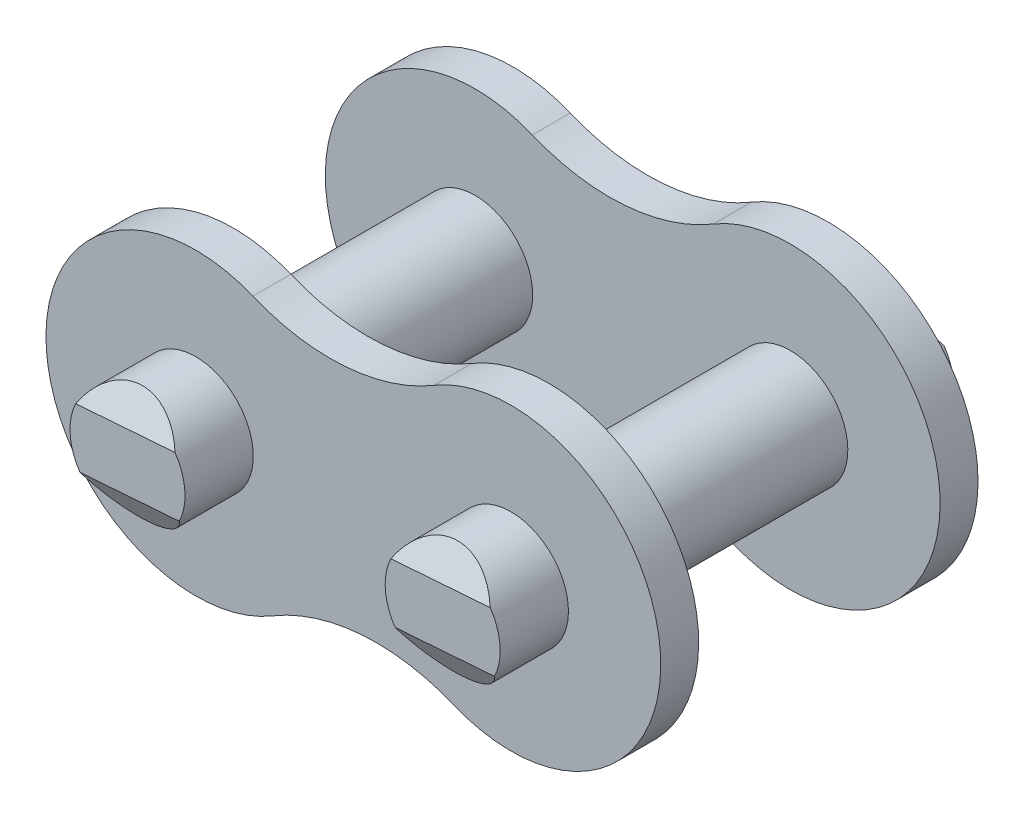
ISO-10303-21;
HEADER;
FILE_DESCRIPTION(('STEP AP214'),'2;1');
FILE_NAME('part.step','',(''),(''),'','','');
FILE_SCHEMA(('AUTOMOTIVE_DESIGN { 1 0 10303 214 1 1 1 1 }'));
ENDSEC;
DATA;
#1=APPLICATION_CONTEXT('core data for automotive mechanical design processes');
#2=APPLICATION_PROTOCOL_DEFINITION('international standard','automotive_design',2000,#1);
#3=PRODUCT_CONTEXT('',#1,'mechanical');
#4=PRODUCT('Part','Part','',(#3));
#5=PRODUCT_RELATED_PRODUCT_CATEGORY('part','',(#4));
#6=PRODUCT_DEFINITION_FORMATION('','',#4);
#7=PRODUCT_DEFINITION_CONTEXT('part definition',#1,'design');
#8=PRODUCT_DEFINITION('design','',#6,#7);
#9=PRODUCT_DEFINITION_SHAPE('','',#8);
#10=(LENGTH_UNIT() NAMED_UNIT(*) SI_UNIT(.MILLI.,.METRE.));
#11=(NAMED_UNIT(*) PLANE_ANGLE_UNIT() SI_UNIT($,.RADIAN.));
#12=(NAMED_UNIT(*) SI_UNIT($,.STERADIAN.) SOLID_ANGLE_UNIT());
#13=UNCERTAINTY_MEASURE_WITH_UNIT(LENGTH_MEASURE(1.E-05),#10,'distance_accuracy_value','');
#14=(GEOMETRIC_REPRESENTATION_CONTEXT(3) GLOBAL_UNCERTAINTY_ASSIGNED_CONTEXT((#13)) GLOBAL_UNIT_ASSIGNED_CONTEXT((#10,
#11,#12)) REPRESENTATION_CONTEXT('',''));
#15=CARTESIAN_POINT('',(0.,0.,0.));
#16=DIRECTION('',(0.,0.,1.));
#17=DIRECTION('',(1.,0.,0.));
#18=AXIS2_PLACEMENT_3D('',#15,#16,#17);
#19=CARTESIAN_POINT('',(127.480334533427,80.0274905231317,-131.392489073474));
#20=DIRECTION('',(-0.0368173091730591,0.49864264332812,0.866025403784439));
#21=DIRECTION('',(0.997285286656241,0.0736346183461183,0.));
#22=AXIS2_PLACEMENT_3D('',#19,#20,#21);
#23=PLANE('',#22);
#24=CARTESIAN_POINT('',(112.953221597664,79.8240147279796,-131.892921853051));
#25=DIRECTION('',(0.0368173091730591,-0.498642643328121,-0.866025403784439));
#26=DIRECTION('',(0.0637694500857102,-0.863674393064751,0.5));
#27=AXIS2_PLACEMENT_3D('',#24,#25,#26);
#28=ELLIPSE('',#27,1.3344874122049,1.1557);
#29=CARTESIAN_POINT('',(113.99391985794,79.3214317785493,-131.5593));
#30=VERTEX_POINT('',#29);
#31=CARTESIAN_POINT('',(111.99762286581,79.1740350716212,-131.5593));
#32=VERTEX_POINT('',#31);
#33=EDGE_CURVE('E277',#30,#32,#28,.T.);
#34=ORIENTED_EDGE('',*,*,#33,.T.);
#35=DIRECTION('',(-0.997285286656241,-0.0736346183461183,0.));
#36=VECTOR('',#35,1.);
#37=CARTESIAN_POINT('',(127.459059651322,80.3156311745789,-131.5593));
#38=LINE('',#37,#36);
#39=EDGE_CURVE('E294',#30,#32,#38,.T.);
#40=ORIENTED_EDGE('',*,*,#39,.F.);
#41=EDGE_LOOP('',(#34,#40));
#42=FACE_BOUND('',#41,.T.);
#43=ADVANCED_FACE('F17',(#42),#23,.F.);
#44=CARTESIAN_POINT('',(127.352685240793,81.7563344318146,-131.392489073474));
#45=DIRECTION('',(-0.0368173091730593,0.498642643328122,-0.866025403784438));
#46=DIRECTION('',(-0.999097546934089,0.,0.0424746007666461));
#47=AXIS2_PLACEMENT_3D('',#44,#45,#46);
#48=PLANE('',#47);
#49=CARTESIAN_POINT('',(112.953221597664,79.8240147279796,-131.892921853051));
#50=DIRECTION('',(0.0368173091730592,-0.498642643328121,0.866025403784439));
#51=DIRECTION('',(-0.0637694500857101,0.863674393064751,0.5));
#52=AXIS2_PLACEMENT_3D('',#49,#50,#51);
#53=ELLIPSE('',#52,1.3344874122049,1.1557);
#54=CARTESIAN_POINT('',(113.908820329517,80.4739943843379,-131.5593));
#55=VERTEX_POINT('',#54);
#56=CARTESIAN_POINT('',(111.912523337387,80.3265976774098,-131.5593));
#57=VERTEX_POINT('',#56);
#58=EDGE_CURVE('E214',#55,#57,#53,.T.);
#59=ORIENTED_EDGE('',*,*,#58,.F.);
#60=DIRECTION('',(-0.997285286656241,-0.0736346183461183,0.));
#61=VECTOR('',#60,1.);
#62=CARTESIAN_POINT('',(127.373960122899,81.4681937803675,-131.5593));
#63=LINE('',#62,#61);
#64=EDGE_CURVE('E290',#55,#57,#63,.T.);
#65=ORIENTED_EDGE('',*,*,#64,.T.);
#66=EDGE_LOOP('',(#59,#65));
#67=FACE_BOUND('',#66,.T.);
#68=ADVANCED_FACE('F430',(#67),#48,.T.);
#69=CARTESIAN_POINT('',(127.480334533427,80.0274905231317,-131.392489073474));
#70=DIRECTION('',(-0.0368173091730591,0.49864264332812,0.866025403784439));
#71=DIRECTION('',(0.997285286656241,0.0736346183461183,0.));
#72=AXIS2_PLACEMENT_3D('',#69,#70,#71);
#73=PLANE('',#72);
#74=CARTESIAN_POINT('',(106.620460027397,79.3564349014817,-131.892921853051));
#75=DIRECTION('',(0.0368173091730591,-0.498642643328121,-0.866025403784439));
#76=DIRECTION('',(0.0637694500857102,-0.863674393064751,0.5));
#77=AXIS2_PLACEMENT_3D('',#74,#75,#76);
#78=ELLIPSE('',#77,1.3344874122049,1.1557);
#79=CARTESIAN_POINT('',(107.661158287673,78.8538519520515,-131.5593));
#80=VERTEX_POINT('',#79);
#81=CARTESIAN_POINT('',(105.664861295543,78.7064552451234,-131.5593));
#82=VERTEX_POINT('',#81);
#83=EDGE_CURVE('E352',#80,#82,#78,.T.);
#84=ORIENTED_EDGE('',*,*,#83,.T.);
#85=DIRECTION('',(-0.997285286656241,-0.0736346183461183,0.));
#86=VECTOR('',#85,1.);
#87=CARTESIAN_POINT('',(127.459059651322,80.3156311745789,-131.5593));
#88=LINE('',#87,#86);
#89=EDGE_CURVE('E349',#80,#82,#88,.T.);
#90=ORIENTED_EDGE('',*,*,#89,.F.);
#91=EDGE_LOOP('',(#84,#90));
#92=FACE_BOUND('',#91,.T.);
#93=ADVANCED_FACE('F424',(#92),#73,.F.);
#94=CARTESIAN_POINT('',(127.352685240793,81.7563344318146,-131.392489073474));
#95=DIRECTION('',(-0.0368173091730593,0.498642643328122,-0.866025403784438));
#96=DIRECTION('',(-0.999097546934089,0.,0.0424746007666461));
#97=AXIS2_PLACEMENT_3D('',#94,#95,#96);
#98=PLANE('',#97);
#99=CARTESIAN_POINT('',(106.620460027397,79.3564349014817,-131.892921853051));
#100=DIRECTION('',(0.0368173091730592,-0.498642643328121,0.866025403784439));
#101=DIRECTION('',(-0.0637694500857101,0.863674393064751,0.5));
#102=AXIS2_PLACEMENT_3D('',#99,#100,#101);
#103=ELLIPSE('',#102,1.3344874122049,1.1557);
#104=CARTESIAN_POINT('',(107.57605875925,80.0064145578401,-131.5593));
#105=VERTEX_POINT('',#104);
#106=CARTESIAN_POINT('',(105.57976176712,79.859017850912,-131.5593));
#107=VERTEX_POINT('',#106);
#108=EDGE_CURVE('E360',#105,#107,#103,.T.);
#109=ORIENTED_EDGE('',*,*,#108,.F.);
#110=DIRECTION('',(-0.997285286656241,-0.0736346183461183,0.));
#111=VECTOR('',#110,1.);
#112=CARTESIAN_POINT('',(127.373960122899,81.4681937803675,-131.5593));
#113=LINE('',#112,#111);
#114=EDGE_CURVE('E345',#105,#107,#113,.T.);
#115=ORIENTED_EDGE('',*,*,#114,.T.);
#116=EDGE_LOOP('',(#109,#115));
#117=FACE_BOUND('',#116,.T.);
#118=ADVANCED_FACE('F414',(#117),#98,.T.);
#119=CARTESIAN_POINT('',(109.78684081253,79.5902248147306,-129.4257));
#120=DIRECTION('',(0.,0.,-1.));
#121=DIRECTION('',(0.,-1.,0.));
#122=AXIS2_PLACEMENT_3D('',#119,#120,#121);
#123=PLANE('',#122);
#124=CARTESIAN_POINT('',(112.953221597664,79.8240147279796,-129.4257));
#125=DIRECTION('',(0.,0.,1.));
#126=DIRECTION('',(-0.997285286656241,-0.0736346183461183,0.));
#127=AXIS2_PLACEMENT_3D('',#124,#125,#126);
#128=CIRCLE('',#127,1.1557);
#129=CARTESIAN_POINT('',(111.800658991875,79.738915199557,-129.4257));
#130=VERTEX_POINT('',#129);
#131=EDGE_CURVE('E327',#130,#130,#128,.T.);
#132=ORIENTED_EDGE('',*,*,#131,.F.);
#133=EDGE_LOOP('',(#132));
#134=FACE_BOUND('',#133,.T.);
#135=CARTESIAN_POINT('',(106.620460027397,79.3564349014817,-129.4257));
#136=DIRECTION('',(0.,0.,1.));
#137=DIRECTION('',(-0.997285286656241,-0.0736346183461183,0.));
#138=AXIS2_PLACEMENT_3D('',#135,#136,#137);
#139=CIRCLE('',#138,1.1557);
#140=CARTESIAN_POINT('',(105.467897421608,79.2713353730591,-129.4257));
#141=VERTEX_POINT('',#140);
#142=EDGE_CURVE('E324',#141,#141,#139,.T.);
#143=ORIENTED_EDGE('',*,*,#142,.F.);
#144=EDGE_LOOP('',(#143));
#145=FACE_BOUND('',#144,.T.);
#146=CARTESIAN_POINT('',(109.321317252168,85.8951369303708,-129.4257));
#147=DIRECTION('',(0.,0.,1.));
#148=DIRECTION('',(-0.997285286656241,-0.0736346183461183,0.));
#149=AXIS2_PLACEMENT_3D('',#146,#147,#148);
#150=CIRCLE('',#149,4.06464973628698);
#151=CARTESIAN_POINT('',(107.769552261372,82.1383560088853,-129.4257));
#152=VERTEX_POINT('',#151);
#153=CARTESIAN_POINT('',(111.408011047593,82.4070018293704,-129.4257));
#154=VERTEX_POINT('',#153);
#155=EDGE_CURVE('E348',#152,#154,#150,.T.);
#156=ORIENTED_EDGE('',*,*,#155,.F.);
#157=CARTESIAN_POINT('',(106.620460027397,79.3564349014817,-129.4257));
#158=DIRECTION('',(0.,0.,1.));
#159=DIRECTION('',(-0.997285286656241,-0.0736346183461183,0.));
#160=AXIS2_PLACEMENT_3D('',#157,#158,#159);
#161=CIRCLE('',#160,3.0099);
#162=CARTESIAN_POINT('',(108.165670577467,76.7734478000909,-129.4257));
#163=VERTEX_POINT('',#162);
#164=EDGE_CURVE('E258',#152,#163,#161,.T.);
#165=ORIENTED_EDGE('',*,*,#164,.T.);
#166=CARTESIAN_POINT('',(110.252364372892,73.2853126990906,-129.4257));
#167=DIRECTION('',(0.,0.,1.));
#168=DIRECTION('',(-0.997285286656241,-0.0736346183461183,0.));
#169=AXIS2_PLACEMENT_3D('',#166,#167,#168);
#170=CIRCLE('',#169,4.06464973628691);
#171=CARTESIAN_POINT('',(111.804129363688,77.042093620576,-129.4257));
#172=VERTEX_POINT('',#171);
#173=EDGE_CURVE('E338',#172,#163,#170,.T.);
#174=ORIENTED_EDGE('',*,*,#173,.F.);
#175=CARTESIAN_POINT('',(112.953221597664,79.8240147279796,-129.4257));
#176=DIRECTION('',(0.,0.,1.));
#177=DIRECTION('',(-0.997285286656241,-0.0736346183461183,0.));
#178=AXIS2_PLACEMENT_3D('',#175,#176,#177);
#179=CIRCLE('',#178,3.0099);
#180=EDGE_CURVE('E26',#172,#154,#179,.T.);
#181=ORIENTED_EDGE('',*,*,#180,.T.);
#182=EDGE_LOOP('',(#156,#165,#174,#181));
#183=FACE_BOUND('',#182,.T.);
#184=ADVANCED_FACE('F412',(#134,#145,#183),#123,.F.);
#185=CARTESIAN_POINT('',(109.78684081253,79.5902248147306,-130.1877));
#186=DIRECTION('',(0.,0.,-1.));
#187=DIRECTION('',(0.,-1.,0.));
#188=AXIS2_PLACEMENT_3D('',#185,#186,#187);
#189=PLANE('',#188);
#190=CARTESIAN_POINT('',(112.953221597664,79.8240147279796,-130.1877));
#191=DIRECTION('',(0.,0.,1.));
#192=DIRECTION('',(-0.997285286656241,-0.0736346183461183,0.));
#193=AXIS2_PLACEMENT_3D('',#190,#191,#192);
#194=CIRCLE('',#193,1.1557);
#195=CARTESIAN_POINT('',(111.800658991875,79.738915199557,-130.1877));
#196=VERTEX_POINT('',#195);
#197=EDGE_CURVE('E281',#196,#196,#194,.T.);
#198=ORIENTED_EDGE('',*,*,#197,.T.);
#199=EDGE_LOOP('',(#198));
#200=FACE_BOUND('',#199,.T.);
#201=CARTESIAN_POINT('',(106.620460027397,79.3564349014817,-130.1877));
#202=DIRECTION('',(0.,0.,1.));
#203=DIRECTION('',(-0.997285286656241,-0.0736346183461183,0.));
#204=AXIS2_PLACEMENT_3D('',#201,#202,#203);
#205=CIRCLE('',#204,1.1557);
#206=CARTESIAN_POINT('',(105.467897421608,79.2713353730591,-130.1877));
#207=VERTEX_POINT('',#206);
#208=EDGE_CURVE('E293',#207,#207,#205,.T.);
#209=ORIENTED_EDGE('',*,*,#208,.T.);
#210=EDGE_LOOP('',(#209));
#211=FACE_BOUND('',#210,.T.);
#212=CARTESIAN_POINT('',(109.321317252168,85.8951369303708,-130.1877));
#213=DIRECTION('',(0.,0.,1.));
#214=DIRECTION('',(-0.997285286656241,-0.0736346183461183,0.));
#215=AXIS2_PLACEMENT_3D('',#212,#213,#214);
#216=CIRCLE('',#215,4.06464973628698);
#217=CARTESIAN_POINT('',(107.769552261372,82.1383560088853,-130.1877));
#218=VERTEX_POINT('',#217);
#219=CARTESIAN_POINT('',(111.408011047593,82.4070018293704,-130.1877));
#220=VERTEX_POINT('',#219);
#221=EDGE_CURVE('E259',#218,#220,#216,.T.);
#222=ORIENTED_EDGE('',*,*,#221,.T.);
#223=CARTESIAN_POINT('',(112.953221597664,79.8240147279796,-130.1877));
#224=DIRECTION('',(0.,0.,1.));
#225=DIRECTION('',(-0.997285286656241,-0.0736346183461183,0.));
#226=AXIS2_PLACEMENT_3D('',#223,#224,#225);
#227=CIRCLE('',#226,3.0099);
#228=CARTESIAN_POINT('',(111.804129363688,77.042093620576,-130.1877));
#229=VERTEX_POINT('',#228);
#230=EDGE_CURVE('E11',#229,#220,#227,.T.);
#231=ORIENTED_EDGE('',*,*,#230,.F.);
#232=CARTESIAN_POINT('',(110.252364372892,73.2853126990906,-130.1877));
#233=DIRECTION('',(0.,0.,1.));
#234=DIRECTION('',(-0.997285286656241,-0.0736346183461183,0.));
#235=AXIS2_PLACEMENT_3D('',#232,#233,#234);
#236=CIRCLE('',#235,4.06464973628691);
#237=CARTESIAN_POINT('',(108.165670577467,76.7734478000909,-130.1877));
#238=VERTEX_POINT('',#237);
#239=EDGE_CURVE('E341',#229,#238,#236,.T.);
#240=ORIENTED_EDGE('',*,*,#239,.T.);
#241=CARTESIAN_POINT('',(106.620460027397,79.3564349014817,-130.1877));
#242=DIRECTION('',(0.,0.,1.));
#243=DIRECTION('',(-0.997285286656241,-0.0736346183461183,0.));
#244=AXIS2_PLACEMENT_3D('',#241,#242,#243);
#245=CIRCLE('',#244,3.0099);
#246=EDGE_CURVE('E378',#218,#238,#245,.T.);
#247=ORIENTED_EDGE('',*,*,#246,.F.);
#248=EDGE_LOOP('',(#222,#231,#240,#247));
#249=FACE_BOUND('',#248,.T.);
#250=ADVANCED_FACE('F406',(#200,#211,#249),#189,.T.);
#251=CARTESIAN_POINT('',(112.953221597664,79.8240147279796,-130.1877));
#252=DIRECTION('',(0.,0.,1.));
#253=DIRECTION('',(0.997285286656241,0.0736346183461183,0.));
#254=AXIS2_PLACEMENT_3D('',#251,#252,#253);
#255=CYLINDRICAL_SURFACE('',#254,3.0099);
#256=ORIENTED_EDGE('',*,*,#180,.F.);
#257=DIRECTION('',(0.,0.,1.));
#258=VECTOR('',#257,1.);
#259=CARTESIAN_POINT('',(111.804129363688,77.042093620576,-130.1877));
#260=LINE('',#259,#258);
#261=EDGE_CURVE('E20',#229,#172,#260,.T.);
#262=ORIENTED_EDGE('',*,*,#261,.F.);
#263=ORIENTED_EDGE('',*,*,#230,.T.);
#264=DIRECTION('',(0.,0.,1.));
#265=VECTOR('',#264,1.);
#266=CARTESIAN_POINT('',(111.408011047593,82.4070018293704,-130.1877));
#267=LINE('',#266,#265);
#268=EDGE_CURVE('E321',#220,#154,#267,.T.);
#269=ORIENTED_EDGE('',*,*,#268,.T.);
#270=EDGE_LOOP('',(#256,#262,#263,#269));
#271=FACE_BOUND('',#270,.T.);
#272=ADVANCED_FACE('F410',(#271),#255,.T.);
#273=CARTESIAN_POINT('',(110.252364372892,73.2853126990906,-130.1877));
#274=DIRECTION('',(0.,0.,1.));
#275=DIRECTION('',(0.997285286656241,0.0736346183461183,0.));
#276=AXIS2_PLACEMENT_3D('',#273,#274,#275);
#277=CYLINDRICAL_SURFACE('',#276,4.06464973628691);
#278=ORIENTED_EDGE('',*,*,#173,.T.);
#279=DIRECTION('',(0.,0.,1.));
#280=VECTOR('',#279,1.);
#281=CARTESIAN_POINT('',(108.165670577467,76.7734478000909,-130.1877));
#282=LINE('',#281,#280);
#283=EDGE_CURVE('E342',#238,#163,#282,.T.);
#284=ORIENTED_EDGE('',*,*,#283,.F.);
#285=ORIENTED_EDGE('',*,*,#239,.F.);
#286=ORIENTED_EDGE('',*,*,#261,.T.);
#287=EDGE_LOOP('',(#278,#284,#285,#286));
#288=FACE_BOUND('',#287,.T.);
#289=ADVANCED_FACE('F411',(#288),#277,.F.);
#290=CARTESIAN_POINT('',(106.620460027397,79.3564349014817,-130.1877));
#291=DIRECTION('',(0.,0.,1.));
#292=DIRECTION('',(0.997285286656241,0.0736346183461183,0.));
#293=AXIS2_PLACEMENT_3D('',#290,#291,#292);
#294=CYLINDRICAL_SURFACE('',#293,3.0099);
#295=ORIENTED_EDGE('',*,*,#164,.F.);
#296=DIRECTION('',(0.,0.,1.));
#297=VECTOR('',#296,1.);
#298=CARTESIAN_POINT('',(107.769552261372,82.1383560088853,-130.1877));
#299=LINE('',#298,#297);
#300=EDGE_CURVE('E254',#218,#152,#299,.T.);
#301=ORIENTED_EDGE('',*,*,#300,.F.);
#302=ORIENTED_EDGE('',*,*,#246,.T.);
#303=ORIENTED_EDGE('',*,*,#283,.T.);
#304=EDGE_LOOP('',(#295,#301,#302,#303));
#305=FACE_BOUND('',#304,.T.);
#306=ADVANCED_FACE('F404',(#305),#294,.T.);
#307=CARTESIAN_POINT('',(109.321317252168,85.8951369303708,-130.1877));
#308=DIRECTION('',(0.,0.,1.));
#309=DIRECTION('',(0.997285286656241,0.0736346183461183,0.));
#310=AXIS2_PLACEMENT_3D('',#307,#308,#309);
#311=CYLINDRICAL_SURFACE('',#310,4.06464973628698);
#312=ORIENTED_EDGE('',*,*,#155,.T.);
#313=ORIENTED_EDGE('',*,*,#268,.F.);
#314=ORIENTED_EDGE('',*,*,#221,.F.);
#315=ORIENTED_EDGE('',*,*,#300,.T.);
#316=EDGE_LOOP('',(#312,#313,#314,#315));
#317=FACE_BOUND('',#316,.T.);
#318=ADVANCED_FACE('F409',(#317),#311,.F.);
#319=CARTESIAN_POINT('',(109.78684081253,79.5902248147306,-131.5593));
#320=DIRECTION('',(0.,0.,-1.));
#321=DIRECTION('',(0.,-1.,0.));
#322=AXIS2_PLACEMENT_3D('',#319,#320,#321);
#323=PLANE('',#322);
#324=ORIENTED_EDGE('',*,*,#89,.T.);
#325=CARTESIAN_POINT('',(106.620460027397,79.3564349014817,-131.5593));
#326=DIRECTION('',(0.,0.,1.));
#327=DIRECTION('',(-0.997285286656241,-0.0736346183461183,0.));
#328=AXIS2_PLACEMENT_3D('',#325,#326,#327);
#329=CIRCLE('',#328,1.1557);
#330=EDGE_CURVE('E364',#107,#82,#329,.T.);
#331=ORIENTED_EDGE('',*,*,#330,.F.);
#332=ORIENTED_EDGE('',*,*,#114,.F.);
#333=CARTESIAN_POINT('',(106.620460027397,79.3564349014817,-131.5593));
#334=DIRECTION('',(0.,0.,1.));
#335=DIRECTION('',(-0.997285286656241,-0.0736346183461183,0.));
#336=AXIS2_PLACEMENT_3D('',#333,#334,#335);
#337=CIRCLE('',#336,1.1557);
#338=EDGE_CURVE('E356',#80,#105,#337,.T.);
#339=ORIENTED_EDGE('',*,*,#338,.F.);
#340=EDGE_LOOP('',(#324,#331,#332,#339));
#341=FACE_BOUND('',#340,.T.);
#342=ADVANCED_FACE('F455',(#341),#323,.T.);
#343=CARTESIAN_POINT('',(106.620460027397,79.3564349014817,-131.5593));
#344=DIRECTION('',(0.,0.,1.));
#345=DIRECTION('',(0.997285286656241,0.0736346183461183,0.));
#346=AXIS2_PLACEMENT_3D('',#343,#344,#345);
#347=CYLINDRICAL_SURFACE('',#346,1.1557);
#348=ORIENTED_EDGE('',*,*,#83,.F.);
#349=ORIENTED_EDGE('',*,*,#338,.T.);
#350=ORIENTED_EDGE('',*,*,#108,.T.);
#351=ORIENTED_EDGE('',*,*,#330,.T.);
#352=EDGE_LOOP('',(#348,#349,#350,#351));
#353=FACE_BOUND('',#352,.T.);
#354=ORIENTED_EDGE('',*,*,#208,.F.);
#355=EDGE_LOOP('',(#354));
#356=FACE_BOUND('',#355,.T.);
#357=ADVANCED_FACE('F447',(#353,#356),#347,.T.);
#358=CARTESIAN_POINT('',(109.78684081253,79.5902248147306,-131.5593));
#359=DIRECTION('',(0.,0.,-1.));
#360=DIRECTION('',(0.,-1.,0.));
#361=AXIS2_PLACEMENT_3D('',#358,#359,#360);
#362=PLANE('',#361);
#363=ORIENTED_EDGE('',*,*,#39,.T.);
#364=CARTESIAN_POINT('',(112.953221597664,79.8240147279796,-131.5593));
#365=DIRECTION('',(0.,0.,1.));
#366=DIRECTION('',(-0.997285286656241,-0.0736346183461183,0.));
#367=AXIS2_PLACEMENT_3D('',#364,#365,#366);
#368=CIRCLE('',#367,1.1557);
#369=EDGE_CURVE('E218',#57,#32,#368,.T.);
#370=ORIENTED_EDGE('',*,*,#369,.F.);
#371=ORIENTED_EDGE('',*,*,#64,.F.);
#372=CARTESIAN_POINT('',(112.953221597664,79.8240147279796,-131.5593));
#373=DIRECTION('',(0.,0.,1.));
#374=DIRECTION('',(-0.997285286656241,-0.0736346183461183,0.));
#375=AXIS2_PLACEMENT_3D('',#372,#373,#374);
#376=CIRCLE('',#375,1.1557);
#377=EDGE_CURVE('E219',#30,#55,#376,.T.);
#378=ORIENTED_EDGE('',*,*,#377,.F.);
#379=EDGE_LOOP('',(#363,#370,#371,#378));
#380=FACE_BOUND('',#379,.T.);
#381=ADVANCED_FACE('F445',(#380),#362,.T.);
#382=CARTESIAN_POINT('',(112.953221597664,79.8240147279796,-131.5593));
#383=DIRECTION('',(0.,0.,1.));
#384=DIRECTION('',(0.997285286656241,0.0736346183461183,0.));
#385=AXIS2_PLACEMENT_3D('',#382,#383,#384);
#386=CYLINDRICAL_SURFACE('',#385,1.1557);
#387=ORIENTED_EDGE('',*,*,#33,.F.);
#388=ORIENTED_EDGE('',*,*,#377,.T.);
#389=ORIENTED_EDGE('',*,*,#58,.T.);
#390=ORIENTED_EDGE('',*,*,#369,.T.);
#391=EDGE_LOOP('',(#387,#388,#389,#390));
#392=FACE_BOUND('',#391,.T.);
#393=ORIENTED_EDGE('',*,*,#197,.F.);
#394=EDGE_LOOP('',(#393));
#395=FACE_BOUND('',#394,.T.);
#396=ADVANCED_FACE('F440',(#392,#395),#386,.T.);
#397=CARTESIAN_POINT('',(127.480334533427,80.0274905231317,-122.607510926526));
#398=DIRECTION('',(-0.0368173091730591,0.49864264332812,-0.866025403784439));
#399=DIRECTION('',(-0.999097546934089,0.,0.0424746007666458));
#400=AXIS2_PLACEMENT_3D('',#397,#398,#399);
#401=PLANE('',#400);
#402=CARTESIAN_POINT('',(112.953221597664,79.8240147279796,-122.107078146949));
#403=DIRECTION('',(-0.0368173091730591,0.498642643328121,-0.866025403784439));
#404=DIRECTION('',(0.0637694500857102,-0.863674393064751,-0.5));
#405=AXIS2_PLACEMENT_3D('',#402,#403,#404);
#406=ELLIPSE('',#405,1.3344874122049,1.1557);
#407=CARTESIAN_POINT('',(113.99391985794,79.3214317785493,-122.4407));
#408=VERTEX_POINT('',#407);
#409=CARTESIAN_POINT('',(111.99762286581,79.1740350716212,-122.4407));
#410=VERTEX_POINT('',#409);
#411=EDGE_CURVE('E202',#408,#410,#406,.T.);
#412=ORIENTED_EDGE('',*,*,#411,.F.);
#413=DIRECTION('',(-0.997285286656241,-0.0736346183461183,0.));
#414=VECTOR('',#413,1.);
#415=CARTESIAN_POINT('',(127.459059651322,80.3156311745789,-122.4407));
#416=LINE('',#415,#414);
#417=EDGE_CURVE('E220',#408,#410,#416,.T.);
#418=ORIENTED_EDGE('',*,*,#417,.T.);
#419=EDGE_LOOP('',(#412,#418));
#420=FACE_BOUND('',#419,.T.);
#421=ADVANCED_FACE('F453',(#420),#401,.F.);
#422=CARTESIAN_POINT('',(127.352685240793,81.7563344318146,-122.607510926526));
#423=DIRECTION('',(-0.0368173091730593,0.498642643328122,0.866025403784438));
#424=DIRECTION('',(0.997285286656241,0.0736346183461184,0.));
#425=AXIS2_PLACEMENT_3D('',#422,#423,#424);
#426=PLANE('',#425);
#427=CARTESIAN_POINT('',(112.953221597664,79.8240147279796,-122.107078146949));
#428=DIRECTION('',(-0.0368173091730592,0.498642643328121,0.866025403784439));
#429=DIRECTION('',(-0.0637694500857101,0.863674393064751,-0.5));
#430=AXIS2_PLACEMENT_3D('',#427,#428,#429);
#431=ELLIPSE('',#430,1.3344874122049,1.1557);
#432=CARTESIAN_POINT('',(113.908820329517,80.4739943843379,-122.4407));
#433=VERTEX_POINT('',#432);
#434=CARTESIAN_POINT('',(111.912523337387,80.3265976774098,-122.4407));
#435=VERTEX_POINT('',#434);
#436=EDGE_CURVE('E228',#433,#435,#431,.T.);
#437=ORIENTED_EDGE('',*,*,#436,.T.);
#438=DIRECTION('',(-0.997285286656241,-0.0736346183461183,0.));
#439=VECTOR('',#438,1.);
#440=CARTESIAN_POINT('',(127.373960122899,81.4681937803675,-122.4407));
#441=LINE('',#440,#439);
#442=EDGE_CURVE('E223',#433,#435,#441,.T.);
#443=ORIENTED_EDGE('',*,*,#442,.F.);
#444=EDGE_LOOP('',(#437,#443));
#445=FACE_BOUND('',#444,.T.);
#446=ADVANCED_FACE('F594',(#445),#426,.T.);
#447=CARTESIAN_POINT('',(127.480334533427,80.0274905231317,-122.607510926526));
#448=DIRECTION('',(-0.0368173091730591,0.49864264332812,-0.866025403784439));
#449=DIRECTION('',(-0.999097546934089,0.,0.0424746007666458));
#450=AXIS2_PLACEMENT_3D('',#447,#448,#449);
#451=PLANE('',#450);
#452=CARTESIAN_POINT('',(106.620460027397,79.3564349014817,-122.107078146949));
#453=DIRECTION('',(-0.0368173091730591,0.498642643328121,-0.866025403784439));
#454=DIRECTION('',(0.0637694500857102,-0.863674393064751,-0.5));
#455=AXIS2_PLACEMENT_3D('',#452,#453,#454);
#456=ELLIPSE('',#455,1.3344874122049,1.1557);
#457=CARTESIAN_POINT('',(107.661158287673,78.8538519520515,-122.4407));
#458=VERTEX_POINT('',#457);
#459=CARTESIAN_POINT('',(105.664861295543,78.7064552451234,-122.4407));
#460=VERTEX_POINT('',#459);
#461=EDGE_CURVE('E248',#458,#460,#456,.T.);
#462=ORIENTED_EDGE('',*,*,#461,.F.);
#463=DIRECTION('',(-0.997285286656241,-0.0736346183461183,0.));
#464=VECTOR('',#463,1.);
#465=CARTESIAN_POINT('',(127.459059651322,80.3156311745789,-122.4407));
#466=LINE('',#465,#464);
#467=EDGE_CURVE('E246',#458,#460,#466,.T.);
#468=ORIENTED_EDGE('',*,*,#467,.T.);
#469=EDGE_LOOP('',(#462,#468));
#470=FACE_BOUND('',#469,.T.);
#471=ADVANCED_FACE('F665',(#470),#451,.F.);
#472=CARTESIAN_POINT('',(127.352685240793,81.7563344318146,-122.607510926526));
#473=DIRECTION('',(-0.0368173091730593,0.498642643328122,0.866025403784438));
#474=DIRECTION('',(0.997285286656241,0.0736346183461184,0.));
#475=AXIS2_PLACEMENT_3D('',#472,#473,#474);
#476=PLANE('',#475);
#477=CARTESIAN_POINT('',(106.620460027397,79.3564349014817,-122.107078146949));
#478=DIRECTION('',(-0.0368173091730592,0.498642643328121,0.866025403784439));
#479=DIRECTION('',(-0.0637694500857101,0.863674393064751,-0.5));
#480=AXIS2_PLACEMENT_3D('',#477,#478,#479);
#481=ELLIPSE('',#480,1.3344874122049,1.1557);
#482=CARTESIAN_POINT('',(107.57605875925,80.0064145578401,-122.4407));
#483=VERTEX_POINT('',#482);
#484=CARTESIAN_POINT('',(105.57976176712,79.859017850912,-122.4407));
#485=VERTEX_POINT('',#484);
#486=EDGE_CURVE('E263',#483,#485,#481,.T.);
#487=ORIENTED_EDGE('',*,*,#486,.T.);
#488=DIRECTION('',(-0.997285286656241,-0.0736346183461183,0.));
#489=VECTOR('',#488,1.);
#490=CARTESIAN_POINT('',(127.373960122899,81.4681937803675,-122.4407));
#491=LINE('',#490,#489);
#492=EDGE_CURVE('E237',#483,#485,#491,.T.);
#493=ORIENTED_EDGE('',*,*,#492,.F.);
#494=EDGE_LOOP('',(#487,#493));
#495=FACE_BOUND('',#494,.T.);
#496=ADVANCED_FACE('F605',(#495),#476,.T.);
#497=CARTESIAN_POINT('',(112.953221597664,79.8240147279796,-122.4407));
#498=DIRECTION('',(0.,0.,-1.));
#499=DIRECTION('',(0.997285286656241,0.0736346183461183,0.));
#500=AXIS2_PLACEMENT_3D('',#497,#498,#499);
#501=CYLINDRICAL_SURFACE('',#500,1.1557);
#502=ORIENTED_EDGE('',*,*,#131,.T.);
#503=EDGE_LOOP('',(#502));
#504=FACE_BOUND('',#503,.T.);
#505=CARTESIAN_POINT('',(112.953221597664,79.8240147279796,-124.5743));
#506=DIRECTION('',(0.,0.,1.));
#507=DIRECTION('',(-0.997285286656241,-0.0736346183461183,0.));
#508=AXIS2_PLACEMENT_3D('',#505,#506,#507);
#509=CIRCLE('',#508,1.1557);
#510=CARTESIAN_POINT('',(111.800658991875,79.738915199557,-124.5743));
#511=VERTEX_POINT('',#510);
#512=EDGE_CURVE('E318',#511,#511,#509,.T.);
#513=ORIENTED_EDGE('',*,*,#512,.F.);
#514=EDGE_LOOP('',(#513));
#515=FACE_BOUND('',#514,.T.);
#516=ADVANCED_FACE('F601',(#504,#515),#501,.T.);
#517=CARTESIAN_POINT('',(106.620460027397,79.3564349014817,-122.4407));
#518=DIRECTION('',(0.,0.,-1.));
#519=DIRECTION('',(0.997285286656241,0.0736346183461183,0.));
#520=AXIS2_PLACEMENT_3D('',#517,#518,#519);
#521=CYLINDRICAL_SURFACE('',#520,1.1557);
#522=ORIENTED_EDGE('',*,*,#142,.T.);
#523=EDGE_LOOP('',(#522));
#524=FACE_BOUND('',#523,.T.);
#525=CARTESIAN_POINT('',(106.620460027397,79.3564349014817,-124.5743));
#526=DIRECTION('',(0.,0.,1.));
#527=DIRECTION('',(-0.997285286656241,-0.0736346183461183,0.));
#528=AXIS2_PLACEMENT_3D('',#525,#526,#527);
#529=CIRCLE('',#528,1.1557);
#530=CARTESIAN_POINT('',(105.467897421608,79.2713353730591,-124.5743));
#531=VERTEX_POINT('',#530);
#532=EDGE_CURVE('E315',#531,#531,#529,.T.);
#533=ORIENTED_EDGE('',*,*,#532,.F.);
#534=EDGE_LOOP('',(#533));
#535=FACE_BOUND('',#534,.T.);
#536=ADVANCED_FACE('F494',(#524,#535),#521,.T.);
#537=CARTESIAN_POINT('',(109.78684081253,79.5902248147306,-124.5743));
#538=DIRECTION('',(0.,0.,1.));
#539=DIRECTION('',(1.,0.,0.));
#540=AXIS2_PLACEMENT_3D('',#537,#538,#539);
#541=PLANE('',#540);
#542=ORIENTED_EDGE('',*,*,#512,.T.);
#543=EDGE_LOOP('',(#542));
#544=FACE_BOUND('',#543,.T.);
#545=ORIENTED_EDGE('',*,*,#532,.T.);
#546=EDGE_LOOP('',(#545));
#547=FACE_BOUND('',#546,.T.);
#548=CARTESIAN_POINT('',(109.321317252168,85.8951369303708,-124.5743));
#549=DIRECTION('',(0.,0.,1.));
#550=DIRECTION('',(-0.997285286656241,-0.0736346183461183,0.));
#551=AXIS2_PLACEMENT_3D('',#548,#549,#550);
#552=CIRCLE('',#551,4.06464973628698);
#553=CARTESIAN_POINT('',(107.769552261372,82.1383560088853,-124.5743));
#554=VERTEX_POINT('',#553);
#555=CARTESIAN_POINT('',(111.408011047593,82.4070018293704,-124.5743));
#556=VERTEX_POINT('',#555);
#557=EDGE_CURVE('E232',#554,#556,#552,.T.);
#558=ORIENTED_EDGE('',*,*,#557,.T.);
#559=CARTESIAN_POINT('',(112.953221597664,79.8240147279796,-124.5743));
#560=DIRECTION('',(0.,0.,1.));
#561=DIRECTION('',(-0.997285286656241,-0.0736346183461183,0.));
#562=AXIS2_PLACEMENT_3D('',#559,#560,#561);
#563=CIRCLE('',#562,3.0099);
#564=CARTESIAN_POINT('',(111.804129363688,77.042093620576,-124.5743));
#565=VERTEX_POINT('',#564);
#566=EDGE_CURVE('E306',#565,#556,#563,.T.);
#567=ORIENTED_EDGE('',*,*,#566,.F.);
#568=CARTESIAN_POINT('',(110.252364372892,73.2853126990906,-124.5743));
#569=DIRECTION('',(0.,0.,1.));
#570=DIRECTION('',(-0.997285286656241,-0.0736346183461183,0.));
#571=AXIS2_PLACEMENT_3D('',#568,#569,#570);
#572=CIRCLE('',#571,4.06464973628691);
#573=CARTESIAN_POINT('',(108.165670577467,76.7734478000909,-124.5743));
#574=VERTEX_POINT('',#573);
#575=EDGE_CURVE('E302',#565,#574,#572,.T.);
#576=ORIENTED_EDGE('',*,*,#575,.T.);
#577=CARTESIAN_POINT('',(106.620460027397,79.3564349014817,-124.5743));
#578=DIRECTION('',(0.,0.,1.));
#579=DIRECTION('',(-0.997285286656241,-0.0736346183461183,0.));
#580=AXIS2_PLACEMENT_3D('',#577,#578,#579);
#581=CIRCLE('',#580,3.0099);
#582=EDGE_CURVE('E285',#554,#574,#581,.T.);
#583=ORIENTED_EDGE('',*,*,#582,.F.);
#584=EDGE_LOOP('',(#558,#567,#576,#583));
#585=FACE_BOUND('',#584,.T.);
#586=ADVANCED_FACE('F490',(#544,#547,#585),#541,.F.);
#587=CARTESIAN_POINT('',(109.78684081253,79.5902248147306,-123.8123));
#588=DIRECTION('',(0.,0.,1.));
#589=DIRECTION('',(1.,0.,0.));
#590=AXIS2_PLACEMENT_3D('',#587,#588,#589);
#591=PLANE('',#590);
#592=CARTESIAN_POINT('',(112.953221597664,79.8240147279796,-123.8123));
#593=DIRECTION('',(0.,0.,1.));
#594=DIRECTION('',(-0.997285286656241,-0.0736346183461183,0.));
#595=AXIS2_PLACEMENT_3D('',#592,#593,#594);
#596=CIRCLE('',#595,1.1557);
#597=CARTESIAN_POINT('',(111.800658991875,79.738915199557,-123.8123));
#598=VERTEX_POINT('',#597);
#599=EDGE_CURVE('E198',#598,#598,#596,.T.);
#600=ORIENTED_EDGE('',*,*,#599,.F.);
#601=EDGE_LOOP('',(#600));
#602=FACE_BOUND('',#601,.T.);
#603=CARTESIAN_POINT('',(106.620460027397,79.3564349014817,-123.8123));
#604=DIRECTION('',(0.,0.,1.));
#605=DIRECTION('',(-0.997285286656241,-0.0736346183461183,0.));
#606=AXIS2_PLACEMENT_3D('',#603,#604,#605);
#607=CIRCLE('',#606,1.1557);
#608=CARTESIAN_POINT('',(105.467897421608,79.2713353730591,-123.8123));
#609=VERTEX_POINT('',#608);
#610=EDGE_CURVE('E253',#609,#609,#607,.T.);
#611=ORIENTED_EDGE('',*,*,#610,.F.);
#612=EDGE_LOOP('',(#611));
#613=FACE_BOUND('',#612,.T.);
#614=CARTESIAN_POINT('',(109.321317252168,85.8951369303708,-123.8123));
#615=DIRECTION('',(0.,0.,1.));
#616=DIRECTION('',(-0.997285286656241,-0.0736346183461183,0.));
#617=AXIS2_PLACEMENT_3D('',#614,#615,#616);
#618=CIRCLE('',#617,4.06464973628698);
#619=CARTESIAN_POINT('',(107.769552261372,82.1383560088853,-123.8123));
#620=VERTEX_POINT('',#619);
#621=CARTESIAN_POINT('',(111.408011047593,82.4070018293704,-123.8123));
#622=VERTEX_POINT('',#621);
#623=EDGE_CURVE('E244',#620,#622,#618,.T.);
#624=ORIENTED_EDGE('',*,*,#623,.F.);
#625=CARTESIAN_POINT('',(106.620460027397,79.3564349014817,-123.8123));
#626=DIRECTION('',(0.,0.,1.));
#627=DIRECTION('',(-0.997285286656241,-0.0736346183461183,0.));
#628=AXIS2_PLACEMENT_3D('',#625,#626,#627);
#629=CIRCLE('',#628,3.0099);
#630=CARTESIAN_POINT('',(108.165670577467,76.7734478000909,-123.8123));
#631=VERTEX_POINT('',#630);
#632=EDGE_CURVE('E298',#620,#631,#629,.T.);
#633=ORIENTED_EDGE('',*,*,#632,.T.);
#634=CARTESIAN_POINT('',(110.252364372892,73.2853126990906,-123.8123));
#635=DIRECTION('',(0.,0.,1.));
#636=DIRECTION('',(-0.997285286656241,-0.0736346183461183,0.));
#637=AXIS2_PLACEMENT_3D('',#634,#635,#636);
#638=CIRCLE('',#637,4.06464973628691);
#639=CARTESIAN_POINT('',(111.804129363688,77.042093620576,-123.8123));
#640=VERTEX_POINT('',#639);
#641=EDGE_CURVE('E211',#640,#631,#638,.T.);
#642=ORIENTED_EDGE('',*,*,#641,.F.);
#643=CARTESIAN_POINT('',(112.953221597664,79.8240147279796,-123.8123));
#644=DIRECTION('',(0.,0.,1.));
#645=DIRECTION('',(-0.997285286656241,-0.0736346183461183,0.));
#646=AXIS2_PLACEMENT_3D('',#643,#644,#645);
#647=CIRCLE('',#646,3.0099);
#648=EDGE_CURVE('E309',#640,#622,#647,.T.);
#649=ORIENTED_EDGE('',*,*,#648,.T.);
#650=EDGE_LOOP('',(#624,#633,#642,#649));
#651=FACE_BOUND('',#650,.T.);
#652=ADVANCED_FACE('F493',(#602,#613,#651),#591,.T.);
#653=CARTESIAN_POINT('',(112.953221597664,79.8240147279796,-123.8123));
#654=DIRECTION('',(0.,0.,-1.));
#655=DIRECTION('',(0.997285286656241,0.0736346183461183,0.));
#656=AXIS2_PLACEMENT_3D('',#653,#654,#655);
#657=CYLINDRICAL_SURFACE('',#656,3.0099);
#658=ORIENTED_EDGE('',*,*,#566,.T.);
#659=DIRECTION('',(0.,0.,-1.));
#660=VECTOR('',#659,1.);
#661=CARTESIAN_POINT('',(111.408011047593,82.4070018293704,-123.8123));
#662=LINE('',#661,#660);
#663=EDGE_CURVE('E276',#622,#556,#662,.T.);
#664=ORIENTED_EDGE('',*,*,#663,.F.);
#665=ORIENTED_EDGE('',*,*,#648,.F.);
#666=DIRECTION('',(0.,0.,-1.));
#667=VECTOR('',#666,1.);
#668=CARTESIAN_POINT('',(111.804129363688,77.042093620576,-123.8123));
#669=LINE('',#668,#667);
#670=EDGE_CURVE('E305',#640,#565,#669,.T.);
#671=ORIENTED_EDGE('',*,*,#670,.T.);
#672=EDGE_LOOP('',(#658,#664,#665,#671));
#673=FACE_BOUND('',#672,.T.);
#674=ADVANCED_FACE('F502',(#673),#657,.T.);
#675=CARTESIAN_POINT('',(110.252364372892,73.2853126990906,-123.8123));
#676=DIRECTION('',(0.,0.,-1.));
#677=DIRECTION('',(0.997285286656241,0.0736346183461183,0.));
#678=AXIS2_PLACEMENT_3D('',#675,#676,#677);
#679=CYLINDRICAL_SURFACE('',#678,4.06464973628691);
#680=ORIENTED_EDGE('',*,*,#575,.F.);
#681=ORIENTED_EDGE('',*,*,#670,.F.);
#682=ORIENTED_EDGE('',*,*,#641,.T.);
#683=DIRECTION('',(0.,0.,-1.));
#684=VECTOR('',#683,1.);
#685=CARTESIAN_POINT('',(108.165670577467,76.7734478000909,-123.8123));
#686=LINE('',#685,#684);
#687=EDGE_CURVE('E289',#631,#574,#686,.T.);
#688=ORIENTED_EDGE('',*,*,#687,.T.);
#689=EDGE_LOOP('',(#680,#681,#682,#688));
#690=FACE_BOUND('',#689,.T.);
#691=ADVANCED_FACE('F509',(#690),#679,.F.);
#692=CARTESIAN_POINT('',(106.620460027397,79.3564349014817,-123.8123));
#693=DIRECTION('',(0.,0.,-1.));
#694=DIRECTION('',(0.997285286656241,0.0736346183461183,0.));
#695=AXIS2_PLACEMENT_3D('',#692,#693,#694);
#696=CYLINDRICAL_SURFACE('',#695,3.0099);
#697=ORIENTED_EDGE('',*,*,#582,.T.);
#698=ORIENTED_EDGE('',*,*,#687,.F.);
#699=ORIENTED_EDGE('',*,*,#632,.F.);
#700=DIRECTION('',(0.,0.,-1.));
#701=VECTOR('',#700,1.);
#702=CARTESIAN_POINT('',(107.769552261372,82.1383560088853,-123.8123));
#703=LINE('',#702,#701);
#704=EDGE_CURVE('E236',#620,#554,#703,.T.);
#705=ORIENTED_EDGE('',*,*,#704,.T.);
#706=EDGE_LOOP('',(#697,#698,#699,#705));
#707=FACE_BOUND('',#706,.T.);
#708=ADVANCED_FACE('F517',(#707),#696,.T.);
#709=CARTESIAN_POINT('',(109.321317252168,85.8951369303708,-123.8123));
#710=DIRECTION('',(0.,0.,-1.));
#711=DIRECTION('',(0.997285286656241,0.0736346183461183,0.));
#712=AXIS2_PLACEMENT_3D('',#709,#710,#711);
#713=CYLINDRICAL_SURFACE('',#712,4.06464973628698);
#714=ORIENTED_EDGE('',*,*,#557,.F.);
#715=ORIENTED_EDGE('',*,*,#704,.F.);
#716=ORIENTED_EDGE('',*,*,#623,.T.);
#717=ORIENTED_EDGE('',*,*,#663,.T.);
#718=EDGE_LOOP('',(#714,#715,#716,#717));
#719=FACE_BOUND('',#718,.T.);
#720=ADVANCED_FACE('F525',(#719),#713,.F.);
#721=CARTESIAN_POINT('',(109.78684081253,79.5902248147306,-122.4407));
#722=DIRECTION('',(0.,0.,1.));
#723=DIRECTION('',(1.,0.,0.));
#724=AXIS2_PLACEMENT_3D('',#721,#722,#723);
#725=PLANE('',#724);
#726=ORIENTED_EDGE('',*,*,#467,.F.);
#727=CARTESIAN_POINT('',(106.620460027397,79.3564349014817,-122.4407));
#728=DIRECTION('',(0.,0.,1.));
#729=DIRECTION('',(-0.997285286656241,-0.0736346183461183,0.));
#730=AXIS2_PLACEMENT_3D('',#727,#728,#729);
#731=CIRCLE('',#730,1.1557);
#732=EDGE_CURVE('E267',#458,#483,#731,.T.);
#733=ORIENTED_EDGE('',*,*,#732,.T.);
#734=ORIENTED_EDGE('',*,*,#492,.T.);
#735=CARTESIAN_POINT('',(106.620460027397,79.3564349014817,-122.4407));
#736=DIRECTION('',(0.,0.,1.));
#737=DIRECTION('',(-0.997285286656241,-0.0736346183461183,0.));
#738=AXIS2_PLACEMENT_3D('',#735,#736,#737);
#739=CIRCLE('',#738,1.1557);
#740=EDGE_CURVE('E252',#485,#460,#739,.T.);
#741=ORIENTED_EDGE('',*,*,#740,.T.);
#742=EDGE_LOOP('',(#726,#733,#734,#741));
#743=FACE_BOUND('',#742,.T.);
#744=ADVANCED_FACE('F532',(#743),#725,.T.);
#745=CARTESIAN_POINT('',(106.620460027397,79.3564349014817,-122.4407));
#746=DIRECTION('',(0.,0.,-1.));
#747=DIRECTION('',(0.997285286656241,0.0736346183461183,0.));
#748=AXIS2_PLACEMENT_3D('',#745,#746,#747);
#749=CYLINDRICAL_SURFACE('',#748,1.1557);
#750=ORIENTED_EDGE('',*,*,#461,.T.);
#751=ORIENTED_EDGE('',*,*,#740,.F.);
#752=ORIENTED_EDGE('',*,*,#486,.F.);
#753=ORIENTED_EDGE('',*,*,#732,.F.);
#754=EDGE_LOOP('',(#750,#751,#752,#753));
#755=FACE_BOUND('',#754,.T.);
#756=ORIENTED_EDGE('',*,*,#610,.T.);
#757=EDGE_LOOP('',(#756));
#758=FACE_BOUND('',#757,.T.);
#759=ADVANCED_FACE('F551',(#755,#758),#749,.T.);
#760=CARTESIAN_POINT('',(109.78684081253,79.5902248147306,-122.4407));
#761=DIRECTION('',(0.,0.,1.));
#762=DIRECTION('',(1.,0.,0.));
#763=AXIS2_PLACEMENT_3D('',#760,#761,#762);
#764=PLANE('',#763);
#765=ORIENTED_EDGE('',*,*,#417,.F.);
#766=CARTESIAN_POINT('',(112.953221597664,79.8240147279796,-122.4407));
#767=DIRECTION('',(0.,0.,1.));
#768=DIRECTION('',(-0.997285286656241,-0.0736346183461183,0.));
#769=AXIS2_PLACEMENT_3D('',#766,#767,#768);
#770=CIRCLE('',#769,1.1557);
#771=EDGE_CURVE('E224',#408,#433,#770,.T.);
#772=ORIENTED_EDGE('',*,*,#771,.T.);
#773=ORIENTED_EDGE('',*,*,#442,.T.);
#774=CARTESIAN_POINT('',(112.953221597664,79.8240147279796,-122.4407));
#775=DIRECTION('',(0.,0.,1.));
#776=DIRECTION('',(-0.997285286656241,-0.0736346183461183,0.));
#777=AXIS2_PLACEMENT_3D('',#774,#775,#776);
#778=CIRCLE('',#777,1.1557);
#779=EDGE_CURVE('E208',#435,#410,#778,.T.);
#780=ORIENTED_EDGE('',*,*,#779,.T.);
#781=EDGE_LOOP('',(#765,#772,#773,#780));
#782=FACE_BOUND('',#781,.T.);
#783=ADVANCED_FACE('F561',(#782),#764,.T.);
#784=CARTESIAN_POINT('',(112.953221597664,79.8240147279796,-122.4407));
#785=DIRECTION('',(0.,0.,-1.));
#786=DIRECTION('',(0.997285286656241,0.0736346183461183,0.));
#787=AXIS2_PLACEMENT_3D('',#784,#785,#786);
#788=CYLINDRICAL_SURFACE('',#787,1.1557);
#789=ORIENTED_EDGE('',*,*,#411,.T.);
#790=ORIENTED_EDGE('',*,*,#779,.F.);
#791=ORIENTED_EDGE('',*,*,#436,.F.);
#792=ORIENTED_EDGE('',*,*,#771,.F.);
#793=EDGE_LOOP('',(#789,#790,#791,#792));
#794=FACE_BOUND('',#793,.T.);
#795=ORIENTED_EDGE('',*,*,#599,.T.);
#796=EDGE_LOOP('',(#795));
#797=FACE_BOUND('',#796,.T.);
#798=ADVANCED_FACE('F199',(#794,#797),#788,.T.);
#799=CLOSED_SHELL('',(#43,#68,#93,#118,#184,#250,#272,#289,#306,#318,#342,#357,#381,#396,#421,
#446,#471,#496,#516,#536,#586,#652,#674,#691,#708,#720,#744,#759,#783,#798));
#800=MANIFOLD_SOLID_BREP('B1',#799);
#801=ADVANCED_BREP_SHAPE_REPRESENTATION('',(#18,#800),#14);
#802=SHAPE_DEFINITION_REPRESENTATION(#9,#801);
ENDSEC;
END-ISO-10303-21;
